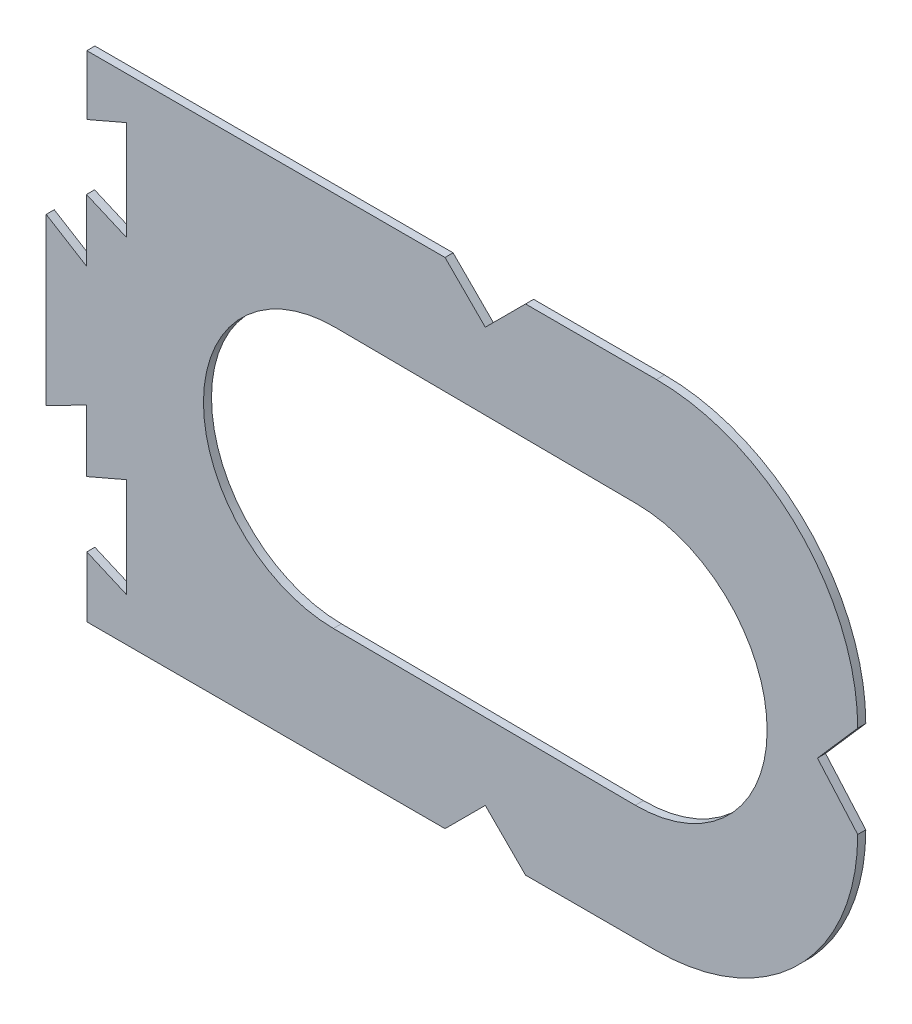
ISO-10303-21;
HEADER;
FILE_DESCRIPTION(('STEP AP214'),'2;1');
FILE_NAME('part.step','',(''),(''),'','','');
FILE_SCHEMA(('AUTOMOTIVE_DESIGN { 1 0 10303 214 1 1 1 1 }'));
ENDSEC;
DATA;
#1=APPLICATION_CONTEXT('core data for automotive mechanical design processes');
#2=APPLICATION_PROTOCOL_DEFINITION('international standard','automotive_design',2000,#1);
#3=PRODUCT_CONTEXT('',#1,'mechanical');
#4=PRODUCT('Part','Part','',(#3));
#5=PRODUCT_RELATED_PRODUCT_CATEGORY('part','',(#4));
#6=PRODUCT_DEFINITION_FORMATION('','',#4);
#7=PRODUCT_DEFINITION_CONTEXT('part definition',#1,'design');
#8=PRODUCT_DEFINITION('design','',#6,#7);
#9=PRODUCT_DEFINITION_SHAPE('','',#8);
#10=(LENGTH_UNIT() NAMED_UNIT(*) SI_UNIT(.MILLI.,.METRE.));
#11=(NAMED_UNIT(*) PLANE_ANGLE_UNIT() SI_UNIT($,.RADIAN.));
#12=(NAMED_UNIT(*) SI_UNIT($,.STERADIAN.) SOLID_ANGLE_UNIT());
#13=UNCERTAINTY_MEASURE_WITH_UNIT(LENGTH_MEASURE(1.E-05),#10,'distance_accuracy_value','');
#14=(GEOMETRIC_REPRESENTATION_CONTEXT(3) GLOBAL_UNCERTAINTY_ASSIGNED_CONTEXT((#13)) GLOBAL_UNIT_ASSIGNED_CONTEXT((#10,
#11,#12)) REPRESENTATION_CONTEXT('',''));
#15=CARTESIAN_POINT('',(0.,0.,0.));
#16=DIRECTION('',(0.,0.,1.));
#17=DIRECTION('',(1.,0.,0.));
#18=AXIS2_PLACEMENT_3D('',#15,#16,#17);
#19=CARTESIAN_POINT('',(273.29155424393,-239.111479539421,2.));
#20=DIRECTION('',(-0.752602119765757,0.658475549526397,0.));
#21=DIRECTION('',(-0.658475549526397,-0.752602119765757,0.));
#22=AXIS2_PLACEMENT_3D('',#19,#20,#21);
#23=PLANE('',#22);
#24=DIRECTION('',(0.658475549526397,0.752602119765757,0.));
#25=VECTOR('',#24,1.);
#26=CARTESIAN_POINT('',(273.29155424393,-239.111479539421,0.));
#27=LINE('',#26,#25);
#28=CARTESIAN_POINT('',(482.497798489954,0.,0.));
#29=VERTEX_POINT('',#28);
#30=CARTESIAN_POINT('',(492.497798489954,11.4294618882517,0.));
#31=VERTEX_POINT('',#30);
#32=EDGE_CURVE('E282',#29,#31,#27,.T.);
#33=ORIENTED_EDGE('',*,*,#32,.T.);
#34=DIRECTION('',(0.,0.,-1.));
#35=VECTOR('',#34,1.);
#36=CARTESIAN_POINT('',(492.497798489954,11.4294618882517,2.));
#37=LINE('',#36,#35);
#38=CARTESIAN_POINT('',(492.497798489954,11.4294618882517,2.));
#39=VERTEX_POINT('',#38);
#40=EDGE_CURVE('E11',#39,#31,#37,.T.);
#41=ORIENTED_EDGE('',*,*,#40,.F.);
#42=DIRECTION('',(0.658475549526397,0.752602119765757,0.));
#43=VECTOR('',#42,1.);
#44=CARTESIAN_POINT('',(273.29155424393,-239.111479539421,2.));
#45=LINE('',#44,#43);
#46=CARTESIAN_POINT('',(482.497798489954,0.,2.));
#47=VERTEX_POINT('',#46);
#48=EDGE_CURVE('E416',#47,#39,#45,.T.);
#49=ORIENTED_EDGE('',*,*,#48,.F.);
#50=DIRECTION('',(0.,0.,-1.));
#51=VECTOR('',#50,1.);
#52=CARTESIAN_POINT('',(482.497798489954,0.,2.));
#53=LINE('',#52,#51);
#54=EDGE_CURVE('E346',#47,#29,#53,.T.);
#55=ORIENTED_EDGE('',*,*,#54,.T.);
#56=EDGE_LOOP('',(#33,#41,#49,#55));
#57=FACE_BOUND('',#56,.T.);
#58=ADVANCED_FACE('F41',(#57),#23,.F.);
#59=CARTESIAN_POINT('',(442.497798489954,11.4294618882521,2.));
#60=DIRECTION('',(0.,0.,-1.));
#61=DIRECTION('',(-1.,0.,0.));
#62=AXIS2_PLACEMENT_3D('',#59,#60,#61);
#63=CYLINDRICAL_SURFACE('',#62,50.);
#64=CARTESIAN_POINT('',(442.497798489954,11.4294618882521,0.));
#65=DIRECTION('',(0.,0.,1.));
#66=DIRECTION('',(1.,0.,0.));
#67=AXIS2_PLACEMENT_3D('',#64,#65,#66);
#68=CIRCLE('',#67,50.);
#69=CARTESIAN_POINT('',(442.497798489954,61.4294618882521,0.));
#70=VERTEX_POINT('',#69);
#71=EDGE_CURVE('E281',#31,#70,#68,.T.);
#72=ORIENTED_EDGE('',*,*,#71,.T.);
#73=DIRECTION('',(0.,0.,-1.));
#74=VECTOR('',#73,1.);
#75=CARTESIAN_POINT('',(442.497798489954,61.4294618882521,2.));
#76=LINE('',#75,#74);
#77=CARTESIAN_POINT('',(442.497798489954,61.4294618882521,2.));
#78=VERTEX_POINT('',#77);
#79=EDGE_CURVE('E51',#78,#70,#76,.T.);
#80=ORIENTED_EDGE('',*,*,#79,.F.);
#81=CARTESIAN_POINT('',(442.497798489954,11.4294618882521,2.));
#82=DIRECTION('',(0.,0.,1.));
#83=DIRECTION('',(1.,0.,0.));
#84=AXIS2_PLACEMENT_3D('',#81,#82,#83);
#85=CIRCLE('',#84,50.);
#86=EDGE_CURVE('E427',#39,#78,#85,.T.);
#87=ORIENTED_EDGE('',*,*,#86,.F.);
#88=ORIENTED_EDGE('',*,*,#40,.T.);
#89=EDGE_LOOP('',(#72,#80,#87,#88));
#90=FACE_BOUND('',#89,.T.);
#91=ADVANCED_FACE('F505',(#90),#63,.T.);
#92=CARTESIAN_POINT('',(0.,61.4294618882521,2.));
#93=DIRECTION('',(0.,-1.,0.));
#94=DIRECTION('',(0.,0.,-1.));
#95=AXIS2_PLACEMENT_3D('',#92,#93,#94);
#96=PLANE('',#95);
#97=DIRECTION('',(-1.,0.,0.));
#98=VECTOR('',#97,1.);
#99=CARTESIAN_POINT('',(0.,61.4294618882521,0.));
#100=LINE('',#99,#98);
#101=CARTESIAN_POINT('',(410.,61.4294618882521,0.));
#102=VERTEX_POINT('',#101);
#103=EDGE_CURVE('E286',#70,#102,#100,.T.);
#104=ORIENTED_EDGE('',*,*,#103,.T.);
#105=DIRECTION('',(0.,0.,-1.));
#106=VECTOR('',#105,1.);
#107=CARTESIAN_POINT('',(410.,61.4294618882521,2.));
#108=LINE('',#107,#106);
#109=CARTESIAN_POINT('',(410.,61.4294618882521,2.));
#110=VERTEX_POINT('',#109);
#111=EDGE_CURVE('E390',#110,#102,#108,.T.);
#112=ORIENTED_EDGE('',*,*,#111,.F.);
#113=DIRECTION('',(-1.,0.,0.));
#114=VECTOR('',#113,1.);
#115=CARTESIAN_POINT('',(0.,61.4294618882521,2.));
#116=LINE('',#115,#114);
#117=EDGE_CURVE('E426',#78,#110,#116,.T.);
#118=ORIENTED_EDGE('',*,*,#117,.F.);
#119=ORIENTED_EDGE('',*,*,#79,.T.);
#120=EDGE_LOOP('',(#104,#112,#118,#119));
#121=FACE_BOUND('',#120,.T.);
#122=ADVANCED_FACE('F509',(#121),#96,.F.);
#123=CARTESIAN_POINT('',(174.285269055874,-174.285269055874,2.));
#124=DIRECTION('',(-0.707106781186547,0.707106781186548,0.));
#125=DIRECTION('',(-0.707106781186548,-0.707106781186547,0.));
#126=AXIS2_PLACEMENT_3D('',#123,#124,#125);
#127=PLANE('',#126);
#128=DIRECTION('',(0.707106781186548,0.707106781186547,0.));
#129=VECTOR('',#128,1.);
#130=CARTESIAN_POINT('',(174.285269055874,-174.285269055874,0.));
#131=LINE('',#130,#129);
#132=CARTESIAN_POINT('',(400.,51.4294618882521,0.));
#133=VERTEX_POINT('',#132);
#134=EDGE_CURVE('E288',#133,#102,#131,.T.);
#135=ORIENTED_EDGE('',*,*,#134,.F.);
#136=DIRECTION('',(0.,0.,-1.));
#137=VECTOR('',#136,1.);
#138=CARTESIAN_POINT('',(400.,51.4294618882521,2.));
#139=LINE('',#138,#137);
#140=CARTESIAN_POINT('',(400.,51.4294618882521,2.));
#141=VERTEX_POINT('',#140);
#142=EDGE_CURVE('E389',#141,#133,#139,.T.);
#143=ORIENTED_EDGE('',*,*,#142,.F.);
#144=DIRECTION('',(0.707106781186548,0.707106781186547,0.));
#145=VECTOR('',#144,1.);
#146=CARTESIAN_POINT('',(174.285269055874,-174.285269055874,2.));
#147=LINE('',#146,#145);
#148=EDGE_CURVE('E428',#141,#110,#147,.T.);
#149=ORIENTED_EDGE('',*,*,#148,.T.);
#150=ORIENTED_EDGE('',*,*,#111,.T.);
#151=EDGE_LOOP('',(#135,#143,#149,#150));
#152=FACE_BOUND('',#151,.T.);
#153=ADVANCED_FACE('F597',(#152),#127,.T.);
#154=CARTESIAN_POINT('',(225.714730944124,225.714730944126,2.));
#155=DIRECTION('',(-0.707106781186543,-0.707106781186552,0.));
#156=DIRECTION('',(0.707106781186552,-0.707106781186543,0.));
#157=AXIS2_PLACEMENT_3D('',#154,#155,#156);
#158=PLANE('',#157);
#159=DIRECTION('',(-0.707106781186552,0.707106781186543,0.));
#160=VECTOR('',#159,1.);
#161=CARTESIAN_POINT('',(225.714730944124,225.714730944126,0.));
#162=LINE('',#161,#160);
#163=CARTESIAN_POINT('',(390.,61.4294618882521,0.));
#164=VERTEX_POINT('',#163);
#165=EDGE_CURVE('E295',#133,#164,#162,.T.);
#166=ORIENTED_EDGE('',*,*,#165,.T.);
#167=DIRECTION('',(0.,0.,-1.));
#168=VECTOR('',#167,1.);
#169=CARTESIAN_POINT('',(390.,61.4294618882521,2.));
#170=LINE('',#169,#168);
#171=CARTESIAN_POINT('',(390.,61.4294618882521,2.));
#172=VERTEX_POINT('',#171);
#173=EDGE_CURVE('E383',#172,#164,#170,.T.);
#174=ORIENTED_EDGE('',*,*,#173,.F.);
#175=DIRECTION('',(-0.707106781186552,0.707106781186543,0.));
#176=VECTOR('',#175,1.);
#177=CARTESIAN_POINT('',(225.714730944124,225.714730944126,2.));
#178=LINE('',#177,#176);
#179=EDGE_CURVE('E434',#141,#172,#178,.T.);
#180=ORIENTED_EDGE('',*,*,#179,.F.);
#181=ORIENTED_EDGE('',*,*,#142,.T.);
#182=EDGE_LOOP('',(#166,#174,#180,#181));
#183=FACE_BOUND('',#182,.T.);
#184=ADVANCED_FACE('F595',(#183),#158,.F.);
#185=CARTESIAN_POINT('',(0.,61.4294618882521,2.));
#186=DIRECTION('',(0.,-1.,0.));
#187=DIRECTION('',(0.,0.,-1.));
#188=AXIS2_PLACEMENT_3D('',#185,#186,#187);
#189=PLANE('',#188);
#190=DIRECTION('',(-1.,0.,0.));
#191=VECTOR('',#190,1.);
#192=CARTESIAN_POINT('',(0.,61.4294618882521,0.));
#193=LINE('',#192,#191);
#194=CARTESIAN_POINT('',(301.035941300096,61.4294618882521,0.));
#195=VERTEX_POINT('',#194);
#196=EDGE_CURVE('E294',#164,#195,#193,.T.);
#197=ORIENTED_EDGE('',*,*,#196,.T.);
#198=DIRECTION('',(0.,0.,-1.));
#199=VECTOR('',#198,1.);
#200=CARTESIAN_POINT('',(301.035941300096,61.4294618882521,2.));
#201=LINE('',#200,#199);
#202=CARTESIAN_POINT('',(301.035941300096,61.4294618882521,2.));
#203=VERTEX_POINT('',#202);
#204=EDGE_CURVE('E381',#203,#195,#201,.T.);
#205=ORIENTED_EDGE('',*,*,#204,.F.);
#206=DIRECTION('',(-1.,0.,0.));
#207=VECTOR('',#206,1.);
#208=CARTESIAN_POINT('',(0.,61.4294618882521,2.));
#209=LINE('',#208,#207);
#210=EDGE_CURVE('E435',#172,#203,#209,.T.);
#211=ORIENTED_EDGE('',*,*,#210,.F.);
#212=ORIENTED_EDGE('',*,*,#173,.T.);
#213=EDGE_LOOP('',(#197,#205,#211,#212));
#214=FACE_BOUND('',#213,.T.);
#215=ADVANCED_FACE('F588',(#214),#189,.F.);
#216=CARTESIAN_POINT('',(301.035941300096,0.,2.));
#217=DIRECTION('',(-1.,0.,0.));
#218=DIRECTION('',(0.,0.,1.));
#219=AXIS2_PLACEMENT_3D('',#216,#217,#218);
#220=PLANE('',#219);
#221=DIRECTION('',(0.,1.,0.));
#222=VECTOR('',#221,1.);
#223=CARTESIAN_POINT('',(301.035941300096,0.,0.));
#224=LINE('',#223,#222);
#225=CARTESIAN_POINT('',(301.035941300096,46.6175692373247,0.));
#226=VERTEX_POINT('',#225);
#227=EDGE_CURVE('E297',#226,#195,#224,.T.);
#228=ORIENTED_EDGE('',*,*,#227,.F.);
#229=DIRECTION('',(0.,0.,-1.));
#230=VECTOR('',#229,1.);
#231=CARTESIAN_POINT('',(301.035941300096,46.6175692373247,2.));
#232=LINE('',#231,#230);
#233=CARTESIAN_POINT('',(301.035941300096,46.6175692373247,2.));
#234=VERTEX_POINT('',#233);
#235=EDGE_CURVE('E382',#234,#226,#232,.T.);
#236=ORIENTED_EDGE('',*,*,#235,.F.);
#237=DIRECTION('',(0.,1.,0.));
#238=VECTOR('',#237,1.);
#239=CARTESIAN_POINT('',(301.035941300096,0.,2.));
#240=LINE('',#239,#238);
#241=EDGE_CURVE('E437',#234,#203,#240,.T.);
#242=ORIENTED_EDGE('',*,*,#241,.T.);
#243=ORIENTED_EDGE('',*,*,#204,.T.);
#244=EDGE_LOOP('',(#228,#236,#242,#243));
#245=FACE_BOUND('',#244,.T.);
#246=ADVANCED_FACE('F582',(#245),#220,.T.);
#247=CARTESIAN_POINT('',(30.3733462315486,-70.3086718322881,2.));
#248=DIRECTION('',(0.396576689295303,-0.918001595590975,0.));
#249=DIRECTION('',(0.918001595590975,0.396576689295303,0.));
#250=AXIS2_PLACEMENT_3D('',#247,#248,#249);
#251=PLANE('',#250);
#252=DIRECTION('',(-0.918001595590975,-0.396576689295303,0.));
#253=VECTOR('',#252,1.);
#254=CARTESIAN_POINT('',(30.3733462315486,-70.3086718322881,0.));
#255=LINE('',#254,#253);
#256=CARTESIAN_POINT('',(310.95036986411,50.9006023769787,0.));
#257=VERTEX_POINT('',#256);
#258=EDGE_CURVE('E300',#257,#226,#255,.T.);
#259=ORIENTED_EDGE('',*,*,#258,.F.);
#260=DIRECTION('',(0.,0.,-1.));
#261=VECTOR('',#260,1.);
#262=CARTESIAN_POINT('',(310.95036986411,50.9006023769787,2.));
#263=LINE('',#262,#261);
#264=CARTESIAN_POINT('',(310.95036986411,50.9006023769787,2.));
#265=VERTEX_POINT('',#264);
#266=EDGE_CURVE('E378',#265,#257,#263,.T.);
#267=ORIENTED_EDGE('',*,*,#266,.F.);
#268=DIRECTION('',(-0.918001595590975,-0.396576689295303,0.));
#269=VECTOR('',#268,1.);
#270=CARTESIAN_POINT('',(30.3733462315486,-70.3086718322881,2.));
#271=LINE('',#270,#269);
#272=EDGE_CURVE('E439',#265,#234,#271,.T.);
#273=ORIENTED_EDGE('',*,*,#272,.T.);
#274=ORIENTED_EDGE('',*,*,#235,.T.);
#275=EDGE_LOOP('',(#259,#267,#273,#274));
#276=FACE_BOUND('',#275,.T.);
#277=ADVANCED_FACE('F577',(#276),#251,.T.);
#278=CARTESIAN_POINT('',(310.95036986411,0.,2.));
#279=DIRECTION('',(1.,0.,0.));
#280=DIRECTION('',(0.,0.,-1.));
#281=AXIS2_PLACEMENT_3D('',#278,#279,#280);
#282=PLANE('',#281);
#283=DIRECTION('',(0.,-1.,0.));
#284=VECTOR('',#283,1.);
#285=CARTESIAN_POINT('',(310.95036986411,0.,0.));
#286=LINE('',#285,#284);
#287=CARTESIAN_POINT('',(310.950369864109,26.1399410142955,0.));
#288=VERTEX_POINT('',#287);
#289=EDGE_CURVE('E301',#257,#288,#286,.T.);
#290=ORIENTED_EDGE('',*,*,#289,.T.);
#291=DIRECTION('',(0.,0.,-1.));
#292=VECTOR('',#291,1.);
#293=CARTESIAN_POINT('',(310.950369864109,26.1399410142955,2.));
#294=LINE('',#293,#292);
#295=CARTESIAN_POINT('',(310.950369864109,26.1399410142955,2.));
#296=VERTEX_POINT('',#295);
#297=EDGE_CURVE('E377',#296,#288,#294,.T.);
#298=ORIENTED_EDGE('',*,*,#297,.F.);
#299=DIRECTION('',(0.,-1.,0.));
#300=VECTOR('',#299,1.);
#301=CARTESIAN_POINT('',(310.95036986411,0.,2.));
#302=LINE('',#301,#300);
#303=EDGE_CURVE('E441',#265,#296,#302,.T.);
#304=ORIENTED_EDGE('',*,*,#303,.F.);
#305=ORIENTED_EDGE('',*,*,#266,.T.);
#306=EDGE_LOOP('',(#290,#298,#304,#305));
#307=FACE_BOUND('',#306,.T.);
#308=ADVANCED_FACE('F578',(#307),#282,.F.);
#309=CARTESIAN_POINT('',(58.4205749619894,135.232812412012,2.));
#310=DIRECTION('',(0.396576689295303,0.918001595590975,0.));
#311=DIRECTION('',(-0.918001595590975,0.396576689295303,0.));
#312=AXIS2_PLACEMENT_3D('',#309,#310,#311);
#313=PLANE('',#312);
#314=DIRECTION('',(0.918001595590975,-0.396576689295303,0.));
#315=VECTOR('',#314,1.);
#316=CARTESIAN_POINT('',(58.4205749619894,135.232812412012,0.));
#317=LINE('',#316,#315);
#318=CARTESIAN_POINT('',(300.95036986411,30.4599410142954,0.));
#319=VERTEX_POINT('',#318);
#320=EDGE_CURVE('E308',#319,#288,#317,.T.);
#321=ORIENTED_EDGE('',*,*,#320,.F.);
#322=DIRECTION('',(0.,0.,-1.));
#323=VECTOR('',#322,1.);
#324=CARTESIAN_POINT('',(300.95036986411,30.4599410142954,2.));
#325=LINE('',#324,#323);
#326=CARTESIAN_POINT('',(300.95036986411,30.4599410142954,2.));
#327=VERTEX_POINT('',#326);
#328=EDGE_CURVE('E373',#327,#319,#325,.T.);
#329=ORIENTED_EDGE('',*,*,#328,.F.);
#330=DIRECTION('',(0.918001595590975,-0.396576689295303,0.));
#331=VECTOR('',#330,1.);
#332=CARTESIAN_POINT('',(58.4205749619894,135.232812412012,2.));
#333=LINE('',#332,#331);
#334=EDGE_CURVE('E442',#327,#296,#333,.T.);
#335=ORIENTED_EDGE('',*,*,#334,.T.);
#336=ORIENTED_EDGE('',*,*,#297,.T.);
#337=EDGE_LOOP('',(#321,#329,#335,#336));
#338=FACE_BOUND('',#337,.T.);
#339=ADVANCED_FACE('F572',(#338),#313,.T.);
#340=CARTESIAN_POINT('',(300.95036986411,0.,2.));
#341=DIRECTION('',(-1.,0.,0.));
#342=DIRECTION('',(0.,0.,1.));
#343=AXIS2_PLACEMENT_3D('',#340,#341,#342);
#344=PLANE('',#343);
#345=DIRECTION('',(0.,1.,0.));
#346=VECTOR('',#345,1.);
#347=CARTESIAN_POINT('',(300.95036986411,0.,0.));
#348=LINE('',#347,#346);
#349=CARTESIAN_POINT('',(300.95036986411,15.0334080134951,0.));
#350=VERTEX_POINT('',#349);
#351=EDGE_CURVE('E309',#350,#319,#348,.T.);
#352=ORIENTED_EDGE('',*,*,#351,.F.);
#353=DIRECTION('',(0.,0.,-1.));
#354=VECTOR('',#353,1.);
#355=CARTESIAN_POINT('',(300.95036986411,15.0334080134951,2.));
#356=LINE('',#355,#354);
#357=CARTESIAN_POINT('',(300.95036986411,15.0334080134951,2.));
#358=VERTEX_POINT('',#357);
#359=EDGE_CURVE('E374',#358,#350,#356,.T.);
#360=ORIENTED_EDGE('',*,*,#359,.F.);
#361=DIRECTION('',(0.,1.,0.));
#362=VECTOR('',#361,1.);
#363=CARTESIAN_POINT('',(300.95036986411,0.,2.));
#364=LINE('',#363,#362);
#365=EDGE_CURVE('E448',#358,#327,#364,.T.);
#366=ORIENTED_EDGE('',*,*,#365,.T.);
#367=ORIENTED_EDGE('',*,*,#328,.T.);
#368=EDGE_LOOP('',(#352,#360,#366,#367));
#369=FACE_BOUND('',#368,.T.);
#370=ADVANCED_FACE('F569',(#369),#344,.T.);
#371=CARTESIAN_POINT('',(89.0980062088606,145.110759297818,2.));
#372=DIRECTION('',(0.523241319031515,0.852184558683247,0.));
#373=DIRECTION('',(-0.852184558683247,0.523241319031515,0.));
#374=AXIS2_PLACEMENT_3D('',#371,#372,#373);
#375=PLANE('',#374);
#376=DIRECTION('',(0.852184558683247,-0.523241319031515,0.));
#377=VECTOR('',#376,1.);
#378=CARTESIAN_POINT('',(89.0980062088606,145.110759297818,0.));
#379=LINE('',#378,#377);
#380=CARTESIAN_POINT('',(290.95036986411,21.1734080134951,0.));
#381=VERTEX_POINT('',#380);
#382=EDGE_CURVE('E315',#381,#350,#379,.T.);
#383=ORIENTED_EDGE('',*,*,#382,.F.);
#384=DIRECTION('',(0.,0.,-1.));
#385=VECTOR('',#384,1.);
#386=CARTESIAN_POINT('',(290.95036986411,21.1734080134951,2.));
#387=LINE('',#386,#385);
#388=CARTESIAN_POINT('',(290.95036986411,21.1734080134951,2.));
#389=VERTEX_POINT('',#388);
#390=EDGE_CURVE('E372',#389,#381,#387,.T.);
#391=ORIENTED_EDGE('',*,*,#390,.F.);
#392=DIRECTION('',(0.852184558683247,-0.523241319031515,0.));
#393=VECTOR('',#392,1.);
#394=CARTESIAN_POINT('',(89.0980062088606,145.110759297818,2.));
#395=LINE('',#394,#393);
#396=EDGE_CURVE('E451',#389,#358,#395,.T.);
#397=ORIENTED_EDGE('',*,*,#396,.T.);
#398=ORIENTED_EDGE('',*,*,#359,.T.);
#399=EDGE_LOOP('',(#383,#391,#397,#398));
#400=FACE_BOUND('',#399,.T.);
#401=ADVANCED_FACE('F564',(#400),#375,.T.);
#402=CARTESIAN_POINT('',(290.95036986411,0.,2.));
#403=DIRECTION('',(1.,0.,0.));
#404=DIRECTION('',(0.,0.,-1.));
#405=AXIS2_PLACEMENT_3D('',#402,#403,#404);
#406=PLANE('',#405);
#407=DIRECTION('',(0.,-1.,0.));
#408=VECTOR('',#407,1.);
#409=CARTESIAN_POINT('',(290.95036986411,0.,0.));
#410=LINE('',#409,#408);
#411=CARTESIAN_POINT('',(290.95036986411,-19.9701371269844,0.));
#412=VERTEX_POINT('',#411);
#413=EDGE_CURVE('E314',#381,#412,#410,.T.);
#414=ORIENTED_EDGE('',*,*,#413,.T.);
#415=DIRECTION('',(0.,0.,-1.));
#416=VECTOR('',#415,1.);
#417=CARTESIAN_POINT('',(290.95036986411,-19.9701371269844,2.));
#418=LINE('',#417,#416);
#419=CARTESIAN_POINT('',(290.95036986411,-19.9701371269844,2.));
#420=VERTEX_POINT('',#419);
#421=EDGE_CURVE('E367',#420,#412,#418,.T.);
#422=ORIENTED_EDGE('',*,*,#421,.F.);
#423=DIRECTION('',(0.,-1.,0.));
#424=VECTOR('',#423,1.);
#425=CARTESIAN_POINT('',(290.95036986411,0.,2.));
#426=LINE('',#425,#424);
#427=EDGE_CURVE('E452',#389,#420,#426,.T.);
#428=ORIENTED_EDGE('',*,*,#427,.F.);
#429=ORIENTED_EDGE('',*,*,#390,.T.);
#430=EDGE_LOOP('',(#414,#422,#428,#429));
#431=FACE_BOUND('',#430,.T.);
#432=ADVANCED_FACE('F560',(#431),#406,.F.);
#433=CARTESIAN_POINT('',(68.9233112586065,-134.09204525021,2.));
#434=DIRECTION('',(-0.457147041036414,0.88939113042106,0.));
#435=DIRECTION('',(-0.88939113042106,-0.457147041036414,0.));
#436=AXIS2_PLACEMENT_3D('',#433,#434,#435);
#437=PLANE('',#436);
#438=DIRECTION('',(0.88939113042106,0.457147041036414,0.));
#439=VECTOR('',#438,1.);
#440=CARTESIAN_POINT('',(68.9233112586065,-134.09204525021,0.));
#441=LINE('',#440,#439);
#442=CARTESIAN_POINT('',(300.95036986411,-14.8301371269845,0.));
#443=VERTEX_POINT('',#442);
#444=EDGE_CURVE('E320',#412,#443,#441,.T.);
#445=ORIENTED_EDGE('',*,*,#444,.T.);
#446=DIRECTION('',(0.,0.,-1.));
#447=VECTOR('',#446,1.);
#448=CARTESIAN_POINT('',(300.95036986411,-14.8301371269845,2.));
#449=LINE('',#448,#447);
#450=CARTESIAN_POINT('',(300.95036986411,-14.8301371269845,2.));
#451=VERTEX_POINT('',#450);
#452=EDGE_CURVE('E366',#451,#443,#449,.T.);
#453=ORIENTED_EDGE('',*,*,#452,.F.);
#454=DIRECTION('',(0.88939113042106,0.457147041036414,0.));
#455=VECTOR('',#454,1.);
#456=CARTESIAN_POINT('',(68.9233112586065,-134.09204525021,2.));
#457=LINE('',#456,#455);
#458=EDGE_CURVE('E456',#420,#451,#457,.T.);
#459=ORIENTED_EDGE('',*,*,#458,.F.);
#460=ORIENTED_EDGE('',*,*,#421,.T.);
#461=EDGE_LOOP('',(#445,#453,#459,#460));
#462=FACE_BOUND('',#461,.T.);
#463=ADVANCED_FACE('F556',(#462),#437,.F.);
#464=CARTESIAN_POINT('',(300.95036986411,0.,2.));
#465=DIRECTION('',(-1.,0.,0.));
#466=DIRECTION('',(0.,0.,1.));
#467=AXIS2_PLACEMENT_3D('',#464,#465,#466);
#468=PLANE('',#467);
#469=DIRECTION('',(0.,1.,0.));
#470=VECTOR('',#469,1.);
#471=CARTESIAN_POINT('',(300.95036986411,0.,0.));
#472=LINE('',#471,#470);
#473=CARTESIAN_POINT('',(300.95036986411,-30.2193976230213,0.));
#474=VERTEX_POINT('',#473);
#475=EDGE_CURVE('E319',#474,#443,#472,.T.);
#476=ORIENTED_EDGE('',*,*,#475,.F.);
#477=DIRECTION('',(0.,0.,-1.));
#478=VECTOR('',#477,1.);
#479=CARTESIAN_POINT('',(300.95036986411,-30.2193976230213,2.));
#480=LINE('',#479,#478);
#481=CARTESIAN_POINT('',(300.95036986411,-30.2193976230213,2.));
#482=VERTEX_POINT('',#481);
#483=EDGE_CURVE('E362',#482,#474,#480,.T.);
#484=ORIENTED_EDGE('',*,*,#483,.F.);
#485=DIRECTION('',(0.,1.,0.));
#486=VECTOR('',#485,1.);
#487=CARTESIAN_POINT('',(300.95036986411,0.,2.));
#488=LINE('',#487,#486);
#489=EDGE_CURVE('E457',#482,#451,#488,.T.);
#490=ORIENTED_EDGE('',*,*,#489,.T.);
#491=ORIENTED_EDGE('',*,*,#452,.T.);
#492=EDGE_LOOP('',(#476,#484,#490,#491));
#493=FACE_BOUND('',#492,.T.);
#494=ADVANCED_FACE('F555',(#493),#468,.T.);
#495=CARTESIAN_POINT('',(58.3330032079793,-135.03010001847,2.));
#496=DIRECTION('',(0.396576689295303,-0.918001595590975,0.));
#497=DIRECTION('',(0.918001595590975,0.396576689295303,0.));
#498=AXIS2_PLACEMENT_3D('',#495,#496,#497);
#499=PLANE('',#498);
#500=DIRECTION('',(-0.918001595590975,-0.396576689295303,0.));
#501=VECTOR('',#500,1.);
#502=CARTESIAN_POINT('',(58.3330032079793,-135.03010001847,0.));
#503=LINE('',#502,#501);
#504=CARTESIAN_POINT('',(310.95036986411,-25.8993976230213,0.));
#505=VERTEX_POINT('',#504);
#506=EDGE_CURVE('E322',#505,#474,#503,.T.);
#507=ORIENTED_EDGE('',*,*,#506,.F.);
#508=DIRECTION('',(0.,0.,-1.));
#509=VECTOR('',#508,1.);
#510=CARTESIAN_POINT('',(310.95036986411,-25.8993976230213,2.));
#511=LINE('',#510,#509);
#512=CARTESIAN_POINT('',(310.95036986411,-25.8993976230213,2.));
#513=VERTEX_POINT('',#512);
#514=EDGE_CURVE('E365',#513,#505,#511,.T.);
#515=ORIENTED_EDGE('',*,*,#514,.F.);
#516=DIRECTION('',(-0.918001595590975,-0.396576689295303,0.));
#517=VECTOR('',#516,1.);
#518=CARTESIAN_POINT('',(58.3330032079793,-135.03010001847,2.));
#519=LINE('',#518,#517);
#520=EDGE_CURVE('E462',#513,#482,#519,.T.);
#521=ORIENTED_EDGE('',*,*,#520,.T.);
#522=ORIENTED_EDGE('',*,*,#483,.T.);
#523=EDGE_LOOP('',(#507,#515,#521,#522));
#524=FACE_BOUND('',#523,.T.);
#525=ADVANCED_FACE('F547',(#524),#499,.T.);
#526=CARTESIAN_POINT('',(310.95036986411,0.,2.));
#527=DIRECTION('',(1.,0.,0.));
#528=DIRECTION('',(0.,0.,-1.));
#529=AXIS2_PLACEMENT_3D('',#526,#527,#528);
#530=PLANE('',#529);
#531=DIRECTION('',(0.,-1.,0.));
#532=VECTOR('',#531,1.);
#533=CARTESIAN_POINT('',(310.95036986411,0.,0.));
#534=LINE('',#533,#532);
#535=CARTESIAN_POINT('',(310.95036986411,-50.6600589857045,0.));
#536=VERTEX_POINT('',#535);
#537=EDGE_CURVE('E327',#505,#536,#534,.T.);
#538=ORIENTED_EDGE('',*,*,#537,.T.);
#539=DIRECTION('',(0.,0.,-1.));
#540=VECTOR('',#539,1.);
#541=CARTESIAN_POINT('',(310.95036986411,-50.6600589857045,2.));
#542=LINE('',#541,#540);
#543=CARTESIAN_POINT('',(310.95036986411,-50.6600589857045,2.));
#544=VERTEX_POINT('',#543);
#545=EDGE_CURVE('E359',#544,#536,#542,.T.);
#546=ORIENTED_EDGE('',*,*,#545,.F.);
#547=DIRECTION('',(0.,-1.,0.));
#548=VECTOR('',#547,1.);
#549=CARTESIAN_POINT('',(310.95036986411,0.,2.));
#550=LINE('',#549,#548);
#551=EDGE_CURVE('E461',#513,#544,#550,.T.);
#552=ORIENTED_EDGE('',*,*,#551,.F.);
#553=ORIENTED_EDGE('',*,*,#514,.T.);
#554=EDGE_LOOP('',(#538,#546,#552,#553));
#555=FACE_BOUND('',#554,.T.);
#556=ADVANCED_FACE('F542',(#555),#530,.F.);
#557=CARTESIAN_POINT('',(30.4609179855589,70.5113842258303,2.));
#558=DIRECTION('',(0.396576689295304,0.918001595590975,0.));
#559=DIRECTION('',(-0.918001595590975,0.396576689295304,0.));
#560=AXIS2_PLACEMENT_3D('',#557,#558,#559);
#561=PLANE('',#560);
#562=DIRECTION('',(0.918001595590975,-0.396576689295304,0.));
#563=VECTOR('',#562,1.);
#564=CARTESIAN_POINT('',(30.4609179855589,70.5113842258303,0.));
#565=LINE('',#564,#563);
#566=CARTESIAN_POINT('',(301.035941300096,-46.3770258460504,0.));
#567=VERTEX_POINT('',#566);
#568=EDGE_CURVE('E326',#567,#536,#565,.T.);
#569=ORIENTED_EDGE('',*,*,#568,.F.);
#570=DIRECTION('',(0.,0.,-1.));
#571=VECTOR('',#570,1.);
#572=CARTESIAN_POINT('',(301.035941300096,-46.3770258460504,2.));
#573=LINE('',#572,#571);
#574=CARTESIAN_POINT('',(301.035941300096,-46.3770258460504,2.));
#575=VERTEX_POINT('',#574);
#576=EDGE_CURVE('E358',#575,#567,#573,.T.);
#577=ORIENTED_EDGE('',*,*,#576,.F.);
#578=DIRECTION('',(0.918001595590975,-0.396576689295304,0.));
#579=VECTOR('',#578,1.);
#580=CARTESIAN_POINT('',(30.4609179855589,70.5113842258303,2.));
#581=LINE('',#580,#579);
#582=EDGE_CURVE('E466',#575,#544,#581,.T.);
#583=ORIENTED_EDGE('',*,*,#582,.T.);
#584=ORIENTED_EDGE('',*,*,#545,.T.);
#585=EDGE_LOOP('',(#569,#577,#583,#584));
#586=FACE_BOUND('',#585,.T.);
#587=ADVANCED_FACE('F539',(#586),#561,.T.);
#588=CARTESIAN_POINT('',(301.035941300096,0.,2.));
#589=DIRECTION('',(-1.,0.,0.));
#590=DIRECTION('',(0.,0.,1.));
#591=AXIS2_PLACEMENT_3D('',#588,#589,#590);
#592=PLANE('',#591);
#593=DIRECTION('',(0.,1.,0.));
#594=VECTOR('',#593,1.);
#595=CARTESIAN_POINT('',(301.035941300096,0.,0.));
#596=LINE('',#595,#594);
#597=CARTESIAN_POINT('',(301.035941300096,-61.4294618882521,0.));
#598=VERTEX_POINT('',#597);
#599=EDGE_CURVE('E332',#598,#567,#596,.T.);
#600=ORIENTED_EDGE('',*,*,#599,.F.);
#601=DIRECTION('',(0.,0.,-1.));
#602=VECTOR('',#601,1.);
#603=CARTESIAN_POINT('',(301.035941300096,-61.4294618882521,2.));
#604=LINE('',#603,#602);
#605=CARTESIAN_POINT('',(301.035941300096,-61.4294618882521,2.));
#606=VERTEX_POINT('',#605);
#607=EDGE_CURVE('E356',#606,#598,#604,.T.);
#608=ORIENTED_EDGE('',*,*,#607,.F.);
#609=DIRECTION('',(0.,1.,0.));
#610=VECTOR('',#609,1.);
#611=CARTESIAN_POINT('',(301.035941300096,0.,2.));
#612=LINE('',#611,#610);
#613=EDGE_CURVE('E468',#606,#575,#612,.T.);
#614=ORIENTED_EDGE('',*,*,#613,.T.);
#615=ORIENTED_EDGE('',*,*,#576,.T.);
#616=EDGE_LOOP('',(#600,#608,#614,#615));
#617=FACE_BOUND('',#616,.T.);
#618=ADVANCED_FACE('F536',(#617),#592,.T.);
#619=CARTESIAN_POINT('',(0.,-61.4294618882521,2.));
#620=DIRECTION('',(0.,-1.,0.));
#621=DIRECTION('',(0.,0.,-1.));
#622=AXIS2_PLACEMENT_3D('',#619,#620,#621);
#623=PLANE('',#622);
#624=DIRECTION('',(-1.,0.,0.));
#625=VECTOR('',#624,1.);
#626=CARTESIAN_POINT('',(0.,-61.4294618882521,0.));
#627=LINE('',#626,#625);
#628=CARTESIAN_POINT('',(390.,-61.4294618882521,0.));
#629=VERTEX_POINT('',#628);
#630=EDGE_CURVE('E335',#629,#598,#627,.T.);
#631=ORIENTED_EDGE('',*,*,#630,.F.);
#632=DIRECTION('',(0.,0.,-1.));
#633=VECTOR('',#632,1.);
#634=CARTESIAN_POINT('',(390.,-61.4294618882521,2.));
#635=LINE('',#634,#633);
#636=CARTESIAN_POINT('',(390.,-61.4294618882521,2.));
#637=VERTEX_POINT('',#636);
#638=EDGE_CURVE('E354',#637,#629,#635,.T.);
#639=ORIENTED_EDGE('',*,*,#638,.F.);
#640=DIRECTION('',(-1.,0.,0.));
#641=VECTOR('',#640,1.);
#642=CARTESIAN_POINT('',(0.,-61.4294618882521,2.));
#643=LINE('',#642,#641);
#644=EDGE_CURVE('E475',#637,#606,#643,.T.);
#645=ORIENTED_EDGE('',*,*,#644,.T.);
#646=ORIENTED_EDGE('',*,*,#607,.T.);
#647=EDGE_LOOP('',(#631,#639,#645,#646));
#648=FACE_BOUND('',#647,.T.);
#649=ADVANCED_FACE('F531',(#648),#623,.T.);
#650=CARTESIAN_POINT('',(225.714730944128,-225.714730944126,2.));
#651=DIRECTION('',(0.707106781186551,-0.707106781186544,0.));
#652=DIRECTION('',(0.707106781186544,0.707106781186551,0.));
#653=AXIS2_PLACEMENT_3D('',#650,#651,#652);
#654=PLANE('',#653);
#655=DIRECTION('',(-0.707106781186544,-0.707106781186551,0.));
#656=VECTOR('',#655,1.);
#657=CARTESIAN_POINT('',(225.714730944128,-225.714730944126,0.));
#658=LINE('',#657,#656);
#659=CARTESIAN_POINT('',(400.,-51.4294618882522,0.));
#660=VERTEX_POINT('',#659);
#661=EDGE_CURVE('E336',#660,#629,#658,.T.);
#662=ORIENTED_EDGE('',*,*,#661,.F.);
#663=DIRECTION('',(0.,0.,-1.));
#664=VECTOR('',#663,1.);
#665=CARTESIAN_POINT('',(400.,-51.4294618882522,2.));
#666=LINE('',#665,#664);
#667=CARTESIAN_POINT('',(400.,-51.4294618882522,2.));
#668=VERTEX_POINT('',#667);
#669=EDGE_CURVE('E355',#668,#660,#666,.T.);
#670=ORIENTED_EDGE('',*,*,#669,.F.);
#671=DIRECTION('',(-0.707106781186544,-0.707106781186551,0.));
#672=VECTOR('',#671,1.);
#673=CARTESIAN_POINT('',(225.714730944128,-225.714730944126,2.));
#674=LINE('',#673,#672);
#675=EDGE_CURVE('E261',#668,#637,#674,.T.);
#676=ORIENTED_EDGE('',*,*,#675,.T.);
#677=ORIENTED_EDGE('',*,*,#638,.T.);
#678=EDGE_LOOP('',(#662,#670,#676,#677));
#679=FACE_BOUND('',#678,.T.);
#680=ADVANCED_FACE('F477',(#679),#654,.T.);
#681=CARTESIAN_POINT('',(174.285269055872,174.285269055874,2.));
#682=DIRECTION('',(-0.707106781186544,-0.707106781186551,0.));
#683=DIRECTION('',(0.707106781186551,-0.707106781186544,0.));
#684=AXIS2_PLACEMENT_3D('',#681,#682,#683);
#685=PLANE('',#684);
#686=DIRECTION('',(-0.707106781186551,0.707106781186544,0.));
#687=VECTOR('',#686,1.);
#688=CARTESIAN_POINT('',(174.285269055872,174.285269055874,0.));
#689=LINE('',#688,#687);
#690=CARTESIAN_POINT('',(410.,-61.4294618882521,0.));
#691=VERTEX_POINT('',#690);
#692=EDGE_CURVE('E341',#691,#660,#689,.T.);
#693=ORIENTED_EDGE('',*,*,#692,.F.);
#694=DIRECTION('',(0.,0.,-1.));
#695=VECTOR('',#694,1.);
#696=CARTESIAN_POINT('',(410.,-61.4294618882521,2.));
#697=LINE('',#696,#695);
#698=CARTESIAN_POINT('',(410.,-61.4294618882521,2.));
#699=VERTEX_POINT('',#698);
#700=EDGE_CURVE('E251',#699,#691,#697,.T.);
#701=ORIENTED_EDGE('',*,*,#700,.F.);
#702=DIRECTION('',(-0.707106781186551,0.707106781186544,0.));
#703=VECTOR('',#702,1.);
#704=CARTESIAN_POINT('',(174.285269055872,174.285269055874,2.));
#705=LINE('',#704,#703);
#706=EDGE_CURVE('E263',#699,#668,#705,.T.);
#707=ORIENTED_EDGE('',*,*,#706,.T.);
#708=ORIENTED_EDGE('',*,*,#669,.T.);
#709=EDGE_LOOP('',(#693,#701,#707,#708));
#710=FACE_BOUND('',#709,.T.);
#711=ADVANCED_FACE('F481',(#710),#685,.T.);
#712=CARTESIAN_POINT('',(0.,-61.4294618882525,2.));
#713=DIRECTION('',(0.,-1.,0.));
#714=DIRECTION('',(1.,0.,0.));
#715=AXIS2_PLACEMENT_3D('',#712,#713,#714);
#716=PLANE('',#715);
#717=DIRECTION('',(-1.,0.,0.));
#718=VECTOR('',#717,1.);
#719=CARTESIAN_POINT('',(0.,-61.4294618882525,0.));
#720=LINE('',#719,#718);
#721=CARTESIAN_POINT('',(442.497798489954,-61.4294618882521,0.));
#722=VERTEX_POINT('',#721);
#723=EDGE_CURVE('E248',#722,#691,#720,.T.);
#724=ORIENTED_EDGE('',*,*,#723,.F.);
#725=DIRECTION('',(0.,0.,-1.));
#726=VECTOR('',#725,1.);
#727=CARTESIAN_POINT('',(442.497798489954,-61.4294618882521,2.));
#728=LINE('',#727,#726);
#729=CARTESIAN_POINT('',(442.497798489954,-61.4294618882521,2.));
#730=VERTEX_POINT('',#729);
#731=EDGE_CURVE('E243',#730,#722,#728,.T.);
#732=ORIENTED_EDGE('',*,*,#731,.F.);
#733=DIRECTION('',(-1.,0.,0.));
#734=VECTOR('',#733,1.);
#735=CARTESIAN_POINT('',(0.,-61.4294618882525,2.));
#736=LINE('',#735,#734);
#737=EDGE_CURVE('E246',#730,#699,#736,.T.);
#738=ORIENTED_EDGE('',*,*,#737,.T.);
#739=ORIENTED_EDGE('',*,*,#700,.T.);
#740=EDGE_LOOP('',(#724,#732,#738,#739));
#741=FACE_BOUND('',#740,.T.);
#742=ADVANCED_FACE('F247',(#741),#716,.T.);
#743=CARTESIAN_POINT('',(442.497798489954,-11.4294618882521,2.));
#744=DIRECTION('',(0.,0.,-1.));
#745=DIRECTION('',(-1.,0.,0.));
#746=AXIS2_PLACEMENT_3D('',#743,#744,#745);
#747=CYLINDRICAL_SURFACE('',#746,50.);
#748=CARTESIAN_POINT('',(442.497798489954,-11.4294618882521,0.));
#749=DIRECTION('',(0.,0.,1.));
#750=DIRECTION('',(1.,0.,0.));
#751=AXIS2_PLACEMENT_3D('',#748,#749,#750);
#752=CIRCLE('',#751,50.);
#753=CARTESIAN_POINT('',(492.497798489954,-11.4294618882518,0.));
#754=VERTEX_POINT('',#753);
#755=EDGE_CURVE('E151',#722,#754,#752,.T.);
#756=ORIENTED_EDGE('',*,*,#755,.T.);
#757=DIRECTION('',(0.,0.,-1.));
#758=VECTOR('',#757,1.);
#759=CARTESIAN_POINT('',(492.497798489954,-11.4294618882518,2.));
#760=LINE('',#759,#758);
#761=CARTESIAN_POINT('',(492.497798489954,-11.4294618882518,2.));
#762=VERTEX_POINT('',#761);
#763=EDGE_CURVE('E252',#762,#754,#760,.T.);
#764=ORIENTED_EDGE('',*,*,#763,.F.);
#765=CARTESIAN_POINT('',(442.497798489954,-11.4294618882521,2.));
#766=DIRECTION('',(0.,0.,1.));
#767=DIRECTION('',(1.,0.,0.));
#768=AXIS2_PLACEMENT_3D('',#765,#766,#767);
#769=CIRCLE('',#768,50.);
#770=EDGE_CURVE('E253',#730,#762,#769,.T.);
#771=ORIENTED_EDGE('',*,*,#770,.F.);
#772=ORIENTED_EDGE('',*,*,#731,.T.);
#773=EDGE_LOOP('',(#756,#764,#771,#772));
#774=FACE_BOUND('',#773,.T.);
#775=ADVANCED_FACE('F255',(#774),#747,.T.);
#776=CARTESIAN_POINT('',(437.499073641977,-0.263582991860177,2.));
#777=DIRECTION('',(0.,0.,-1.));
#778=DIRECTION('',(-1.,0.,0.));
#779=AXIS2_PLACEMENT_3D('',#776,#777,#778);
#780=CYLINDRICAL_SURFACE('',#779,32.5);
#781=CARTESIAN_POINT('',(437.499073641977,-0.263582991860177,0.));
#782=DIRECTION('',(0.,0.,1.));
#783=DIRECTION('',(1.,0.,0.));
#784=AXIS2_PLACEMENT_3D('',#781,#782,#783);
#785=CIRCLE('',#784,32.5);
#786=CARTESIAN_POINT('',(437.270635049031,-32.7627801482401,0.));
#787=VERTEX_POINT('',#786);
#788=CARTESIAN_POINT('',(437.727512234922,32.2356141645197,0.));
#789=VERTEX_POINT('',#788);
#790=EDGE_CURVE('E267',#787,#789,#785,.T.);
#791=ORIENTED_EDGE('',*,*,#790,.F.);
#792=DIRECTION('',(0.,0.,-1.));
#793=VECTOR('',#792,1.);
#794=CARTESIAN_POINT('',(437.270635049031,-32.7627801482401,2.));
#795=LINE('',#794,#793);
#796=CARTESIAN_POINT('',(437.270635049031,-32.7627801482401,2.));
#797=VERTEX_POINT('',#796);
#798=EDGE_CURVE('E44',#797,#787,#795,.T.);
#799=ORIENTED_EDGE('',*,*,#798,.F.);
#800=CARTESIAN_POINT('',(437.499073641977,-0.263582991860177,2.));
#801=DIRECTION('',(0.,0.,1.));
#802=DIRECTION('',(1.,0.,0.));
#803=AXIS2_PLACEMENT_3D('',#800,#801,#802);
#804=CIRCLE('',#803,32.5);
#805=CARTESIAN_POINT('',(437.727512234922,32.2356141645197,2.));
#806=VERTEX_POINT('',#805);
#807=EDGE_CURVE('E347',#797,#806,#804,.T.);
#808=ORIENTED_EDGE('',*,*,#807,.T.);
#809=DIRECTION('',(0.,0.,-1.));
#810=VECTOR('',#809,1.);
#811=CARTESIAN_POINT('',(437.727512234922,32.2356141645197,2.));
#812=LINE('',#811,#810);
#813=EDGE_CURVE('E268',#806,#789,#812,.T.);
#814=ORIENTED_EDGE('',*,*,#813,.T.);
#815=EDGE_LOOP('',(#791,#799,#808,#814));
#816=FACE_BOUND('',#815,.T.);
#817=ADVANCED_FACE('F43',(#816),#780,.F.);
#818=CARTESIAN_POINT('',(-0.208676532544292,-29.6877146966359,2.));
#819=DIRECTION('',(0.00702887978293819,0.999975297119382,0.));
#820=DIRECTION('',(-0.999975297119382,0.00702887978293819,0.));
#821=AXIS2_PLACEMENT_3D('',#818,#819,#820);
#822=PLANE('',#821);
#823=DIRECTION('',(0.999975297119382,-0.00702887978293819,0.));
#824=VECTOR('',#823,1.);
#825=CARTESIAN_POINT('',(-0.208676532544292,-29.6877146966359,0.));
#826=LINE('',#825,#824);
#827=CARTESIAN_POINT('',(362.272487765078,-32.2356141645197,0.));
#828=VERTEX_POINT('',#827);
#829=EDGE_CURVE('E275',#828,#787,#826,.T.);
#830=ORIENTED_EDGE('',*,*,#829,.F.);
#831=DIRECTION('',(0.,0.,-1.));
#832=VECTOR('',#831,1.);
#833=CARTESIAN_POINT('',(362.272487765078,-32.2356141645197,2.));
#834=LINE('',#833,#832);
#835=CARTESIAN_POINT('',(362.272487765078,-32.2356141645197,2.));
#836=VERTEX_POINT('',#835);
#837=EDGE_CURVE('E398',#836,#828,#834,.T.);
#838=ORIENTED_EDGE('',*,*,#837,.F.);
#839=DIRECTION('',(0.999975297119382,-0.00702887978293819,0.));
#840=VECTOR('',#839,1.);
#841=CARTESIAN_POINT('',(-0.208676532544292,-29.6877146966359,2.));
#842=LINE('',#841,#840);
#843=EDGE_CURVE('E404',#836,#797,#842,.T.);
#844=ORIENTED_EDGE('',*,*,#843,.T.);
#845=ORIENTED_EDGE('',*,*,#798,.T.);
#846=EDGE_LOOP('',(#830,#838,#844,#845));
#847=FACE_BOUND('',#846,.T.);
#848=ADVANCED_FACE('F403',(#847),#822,.T.);
#849=CARTESIAN_POINT('',(362.500926358023,0.263582991860191,2.));
#850=DIRECTION('',(0.,0.,-1.));
#851=DIRECTION('',(-1.,0.,0.));
#852=AXIS2_PLACEMENT_3D('',#849,#850,#851);
#853=CYLINDRICAL_SURFACE('',#852,32.5);
#854=CARTESIAN_POINT('',(362.500926358023,0.263582991860191,0.));
#855=DIRECTION('',(0.,0.,1.));
#856=DIRECTION('',(1.,0.,0.));
#857=AXIS2_PLACEMENT_3D('',#854,#855,#856);
#858=CIRCLE('',#857,32.5);
#859=CARTESIAN_POINT('',(362.729364950969,32.7627801482401,0.));
#860=VERTEX_POINT('',#859);
#861=EDGE_CURVE('E274',#860,#828,#858,.T.);
#862=ORIENTED_EDGE('',*,*,#861,.F.);
#863=DIRECTION('',(0.,0.,-1.));
#864=VECTOR('',#863,1.);
#865=CARTESIAN_POINT('',(362.729364950969,32.7627801482401,2.));
#866=LINE('',#865,#864);
#867=CARTESIAN_POINT('',(362.729364950969,32.7627801482401,2.));
#868=VERTEX_POINT('',#867);
#869=EDGE_CURVE('E394',#868,#860,#866,.T.);
#870=ORIENTED_EDGE('',*,*,#869,.F.);
#871=CARTESIAN_POINT('',(362.500926358023,0.263582991860191,2.));
#872=DIRECTION('',(0.,0.,1.));
#873=DIRECTION('',(1.,0.,0.));
#874=AXIS2_PLACEMENT_3D('',#871,#872,#873);
#875=CIRCLE('',#874,32.5);
#876=EDGE_CURVE('E413',#868,#836,#875,.T.);
#877=ORIENTED_EDGE('',*,*,#876,.T.);
#878=ORIENTED_EDGE('',*,*,#837,.T.);
#879=EDGE_LOOP('',(#862,#870,#877,#878));
#880=FACE_BOUND('',#879,.T.);
#881=ADVANCED_FACE('F411',(#880),#853,.F.);
#882=CARTESIAN_POINT('',(0.248200653346687,35.3106796161239,2.));
#883=DIRECTION('',(0.0070288797829381,0.999975297119382,0.));
#884=DIRECTION('',(-0.999975297119382,0.0070288797829381,0.));
#885=AXIS2_PLACEMENT_3D('',#882,#883,#884);
#886=PLANE('',#885);
#887=DIRECTION('',(0.999975297119382,-0.0070288797829381,0.));
#888=VECTOR('',#887,1.);
#889=CARTESIAN_POINT('',(0.248200653346687,35.3106796161239,0.));
#890=LINE('',#889,#888);
#891=EDGE_CURVE('E277',#860,#789,#890,.T.);
#892=ORIENTED_EDGE('',*,*,#891,.T.);
#893=ORIENTED_EDGE('',*,*,#813,.F.);
#894=DIRECTION('',(0.999975297119382,-0.0070288797829381,0.));
#895=VECTOR('',#894,1.);
#896=CARTESIAN_POINT('',(0.248200653346687,35.3106796161239,2.));
#897=LINE('',#896,#895);
#898=EDGE_CURVE('E417',#868,#806,#897,.T.);
#899=ORIENTED_EDGE('',*,*,#898,.F.);
#900=ORIENTED_EDGE('',*,*,#869,.T.);
#901=EDGE_LOOP('',(#892,#893,#899,#900));
#902=FACE_BOUND('',#901,.T.);
#903=ADVANCED_FACE('F420',(#902),#886,.F.);
#904=CARTESIAN_POINT('',(273.29155424393,239.111479539421,2.));
#905=DIRECTION('',(-0.752602119765757,-0.658475549526397,0.));
#906=DIRECTION('',(0.658475549526397,-0.752602119765757,0.));
#907=AXIS2_PLACEMENT_3D('',#904,#905,#906);
#908=PLANE('',#907);
#909=DIRECTION('',(-0.658475549526397,0.752602119765757,0.));
#910=VECTOR('',#909,1.);
#911=CARTESIAN_POINT('',(273.29155424393,239.111479539421,0.));
#912=LINE('',#911,#910);
#913=EDGE_CURVE('E160',#754,#29,#912,.T.);
#914=ORIENTED_EDGE('',*,*,#913,.T.);
#915=ORIENTED_EDGE('',*,*,#54,.F.);
#916=DIRECTION('',(-0.658475549526397,0.752602119765757,0.));
#917=VECTOR('',#916,1.);
#918=CARTESIAN_POINT('',(273.29155424393,239.111479539421,2.));
#919=LINE('',#918,#917);
#920=EDGE_CURVE('E58',#762,#47,#919,.T.);
#921=ORIENTED_EDGE('',*,*,#920,.F.);
#922=ORIENTED_EDGE('',*,*,#763,.T.);
#923=EDGE_LOOP('',(#914,#915,#921,#922));
#924=FACE_BOUND('',#923,.T.);
#925=ADVANCED_FACE('F489',(#924),#908,.F.);
#926=CARTESIAN_POINT('',(0.,0.,2.));
#927=DIRECTION('',(0.,0.,1.));
#928=DIRECTION('',(1.,0.,0.));
#929=AXIS2_PLACEMENT_3D('',#926,#927,#928);
#930=PLANE('',#929);
#931=ORIENTED_EDGE('',*,*,#807,.F.);
#932=ORIENTED_EDGE('',*,*,#843,.F.);
#933=ORIENTED_EDGE('',*,*,#876,.F.);
#934=ORIENTED_EDGE('',*,*,#898,.T.);
#935=EDGE_LOOP('',(#931,#932,#933,#934));
#936=FACE_BOUND('',#935,.T.);
#937=ORIENTED_EDGE('',*,*,#48,.T.);
#938=ORIENTED_EDGE('',*,*,#86,.T.);
#939=ORIENTED_EDGE('',*,*,#117,.T.);
#940=ORIENTED_EDGE('',*,*,#148,.F.);
#941=ORIENTED_EDGE('',*,*,#179,.T.);
#942=ORIENTED_EDGE('',*,*,#210,.T.);
#943=ORIENTED_EDGE('',*,*,#241,.F.);
#944=ORIENTED_EDGE('',*,*,#272,.F.);
#945=ORIENTED_EDGE('',*,*,#303,.T.);
#946=ORIENTED_EDGE('',*,*,#334,.F.);
#947=ORIENTED_EDGE('',*,*,#365,.F.);
#948=ORIENTED_EDGE('',*,*,#396,.F.);
#949=ORIENTED_EDGE('',*,*,#427,.T.);
#950=ORIENTED_EDGE('',*,*,#458,.T.);
#951=ORIENTED_EDGE('',*,*,#489,.F.);
#952=ORIENTED_EDGE('',*,*,#520,.F.);
#953=ORIENTED_EDGE('',*,*,#551,.T.);
#954=ORIENTED_EDGE('',*,*,#582,.F.);
#955=ORIENTED_EDGE('',*,*,#613,.F.);
#956=ORIENTED_EDGE('',*,*,#644,.F.);
#957=ORIENTED_EDGE('',*,*,#675,.F.);
#958=ORIENTED_EDGE('',*,*,#706,.F.);
#959=ORIENTED_EDGE('',*,*,#737,.F.);
#960=ORIENTED_EDGE('',*,*,#770,.T.);
#961=ORIENTED_EDGE('',*,*,#920,.T.);
#962=EDGE_LOOP('',(#937,#938,#939,#940,#941,#942,#943,#944,#945,#946,#947,#948,#949,#950,#951,
#952,#953,#954,#955,#956,#957,#958,#959,#960,#961));
#963=FACE_BOUND('',#962,.T.);
#964=ADVANCED_FACE('F256',(#936,#963),#930,.T.);
#965=CARTESIAN_POINT('',(0.,0.,0.));
#966=DIRECTION('',(0.,0.,1.));
#967=DIRECTION('',(1.,0.,0.));
#968=AXIS2_PLACEMENT_3D('',#965,#966,#967);
#969=PLANE('',#968);
#970=ORIENTED_EDGE('',*,*,#790,.T.);
#971=ORIENTED_EDGE('',*,*,#891,.F.);
#972=ORIENTED_EDGE('',*,*,#861,.T.);
#973=ORIENTED_EDGE('',*,*,#829,.T.);
#974=EDGE_LOOP('',(#970,#971,#972,#973));
#975=FACE_BOUND('',#974,.T.);
#976=ORIENTED_EDGE('',*,*,#32,.F.);
#977=ORIENTED_EDGE('',*,*,#913,.F.);
#978=ORIENTED_EDGE('',*,*,#755,.F.);
#979=ORIENTED_EDGE('',*,*,#723,.T.);
#980=ORIENTED_EDGE('',*,*,#692,.T.);
#981=ORIENTED_EDGE('',*,*,#661,.T.);
#982=ORIENTED_EDGE('',*,*,#630,.T.);
#983=ORIENTED_EDGE('',*,*,#599,.T.);
#984=ORIENTED_EDGE('',*,*,#568,.T.);
#985=ORIENTED_EDGE('',*,*,#537,.F.);
#986=ORIENTED_EDGE('',*,*,#506,.T.);
#987=ORIENTED_EDGE('',*,*,#475,.T.);
#988=ORIENTED_EDGE('',*,*,#444,.F.);
#989=ORIENTED_EDGE('',*,*,#413,.F.);
#990=ORIENTED_EDGE('',*,*,#382,.T.);
#991=ORIENTED_EDGE('',*,*,#351,.T.);
#992=ORIENTED_EDGE('',*,*,#320,.T.);
#993=ORIENTED_EDGE('',*,*,#289,.F.);
#994=ORIENTED_EDGE('',*,*,#258,.T.);
#995=ORIENTED_EDGE('',*,*,#227,.T.);
#996=ORIENTED_EDGE('',*,*,#196,.F.);
#997=ORIENTED_EDGE('',*,*,#165,.F.);
#998=ORIENTED_EDGE('',*,*,#134,.T.);
#999=ORIENTED_EDGE('',*,*,#103,.F.);
#1000=ORIENTED_EDGE('',*,*,#71,.F.);
#1001=EDGE_LOOP('',(#976,#977,#978,#979,#980,#981,#982,#983,#984,#985,#986,#987,#988,#989,#990,
#991,#992,#993,#994,#995,#996,#997,#998,#999,#1000));
#1002=FACE_BOUND('',#1001,.T.);
#1003=ADVANCED_FACE('F407',(#975,#1002),#969,.F.);
#1004=CLOSED_SHELL('',(#58,#91,#122,#153,#184,#215,#246,#277,#308,#339,#370,#401,#432,#463,#494,
#525,#556,#587,#618,#649,#680,#711,#742,#775,#817,#848,#881,#903,#925,#964,#1003));
#1005=MANIFOLD_SOLID_BREP('B2',#1004);
#1006=ADVANCED_BREP_SHAPE_REPRESENTATION('',(#18,#1005),#14);
#1007=SHAPE_DEFINITION_REPRESENTATION(#9,#1006);
ENDSEC;
END-ISO-10303-21;
